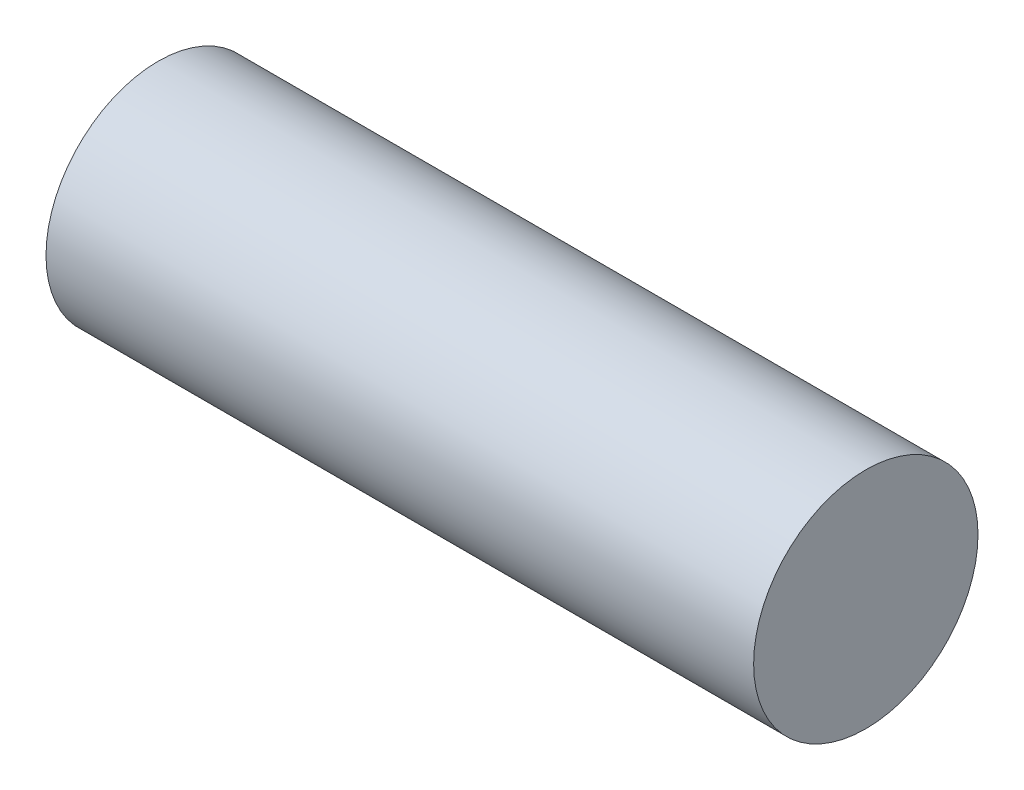
ISO-10303-21;
HEADER;
FILE_DESCRIPTION(('STEP AP214'),'2;1');
FILE_NAME('part.step','',(''),(''),'','','');
FILE_SCHEMA(('AUTOMOTIVE_DESIGN { 1 0 10303 214 1 1 1 1 }'));
ENDSEC;
DATA;
#1=APPLICATION_CONTEXT('core data for automotive mechanical design processes');
#2=APPLICATION_PROTOCOL_DEFINITION('international standard','automotive_design',2000,#1);
#3=PRODUCT_CONTEXT('',#1,'mechanical');
#4=PRODUCT('Part','Part','',(#3));
#5=PRODUCT_RELATED_PRODUCT_CATEGORY('part','',(#4));
#6=PRODUCT_DEFINITION_FORMATION('','',#4);
#7=PRODUCT_DEFINITION_CONTEXT('part definition',#1,'design');
#8=PRODUCT_DEFINITION('design','',#6,#7);
#9=PRODUCT_DEFINITION_SHAPE('','',#8);
#10=(LENGTH_UNIT() NAMED_UNIT(*) SI_UNIT(.MILLI.,.METRE.));
#11=(NAMED_UNIT(*) PLANE_ANGLE_UNIT() SI_UNIT($,.RADIAN.));
#12=(NAMED_UNIT(*) SI_UNIT($,.STERADIAN.) SOLID_ANGLE_UNIT());
#13=UNCERTAINTY_MEASURE_WITH_UNIT(LENGTH_MEASURE(1.E-05),#10,'distance_accuracy_value','');
#14=(GEOMETRIC_REPRESENTATION_CONTEXT(3) GLOBAL_UNCERTAINTY_ASSIGNED_CONTEXT((#13)) GLOBAL_UNIT_ASSIGNED_CONTEXT((#10,
#11,#12)) REPRESENTATION_CONTEXT('',''));
#15=CARTESIAN_POINT('',(0.,0.,0.));
#16=DIRECTION('',(0.,0.,1.));
#17=DIRECTION('',(1.,0.,0.));
#18=AXIS2_PLACEMENT_3D('',#15,#16,#17);
#19=CARTESIAN_POINT('',(20.5,0.,0.));
#20=DIRECTION('',(-1.,0.,0.));
#21=DIRECTION('',(0.,0.,1.));
#22=AXIS2_PLACEMENT_3D('',#19,#20,#21);
#23=CYLINDRICAL_SURFACE('',#22,6.5);
#24=CARTESIAN_POINT('',(20.5,0.,0.));
#25=DIRECTION('',(1.,0.,0.));
#26=DIRECTION('',(0.,0.,-1.));
#27=AXIS2_PLACEMENT_3D('',#24,#25,#26);
#28=CIRCLE('',#27,6.5);
#29=CARTESIAN_POINT('',(20.5,0.,-6.5));
#30=VERTEX_POINT('',#29);
#31=EDGE_CURVE('E10',#30,#30,#28,.T.);
#32=ORIENTED_EDGE('',*,*,#31,.F.);
#33=EDGE_LOOP('',(#32));
#34=FACE_BOUND('',#33,.T.);
#35=CARTESIAN_POINT('',(-20.5,0.,0.));
#36=DIRECTION('',(1.,0.,0.));
#37=DIRECTION('',(0.,0.,-1.));
#38=AXIS2_PLACEMENT_3D('',#35,#36,#37);
#39=CIRCLE('',#38,6.5);
#40=CARTESIAN_POINT('',(-20.5,0.,-6.5));
#41=VERTEX_POINT('',#40);
#42=EDGE_CURVE('E34',#41,#41,#39,.T.);
#43=ORIENTED_EDGE('',*,*,#42,.T.);
#44=EDGE_LOOP('',(#43));
#45=FACE_BOUND('',#44,.T.);
#46=ADVANCED_FACE('F31',(#34,#45),#23,.T.);
#47=CARTESIAN_POINT('',(20.5,0.,0.));
#48=DIRECTION('',(1.,0.,0.));
#49=DIRECTION('',(0.,0.,-1.));
#50=AXIS2_PLACEMENT_3D('',#47,#48,#49);
#51=PLANE('',#50);
#52=ORIENTED_EDGE('',*,*,#31,.T.);
#53=EDGE_LOOP('',(#52));
#54=FACE_BOUND('',#53,.T.);
#55=ADVANCED_FACE('F46',(#54),#51,.T.);
#56=CARTESIAN_POINT('',(-20.5,0.,0.));
#57=DIRECTION('',(1.,0.,0.));
#58=DIRECTION('',(0.,0.,-1.));
#59=AXIS2_PLACEMENT_3D('',#56,#57,#58);
#60=PLANE('',#59);
#61=ORIENTED_EDGE('',*,*,#42,.F.);
#62=EDGE_LOOP('',(#61));
#63=FACE_BOUND('',#62,.T.);
#64=ADVANCED_FACE('F44',(#63),#60,.F.);
#65=CLOSED_SHELL('',(#46,#55,#64));
#66=MANIFOLD_SOLID_BREP('B2',#65);
#67=ADVANCED_BREP_SHAPE_REPRESENTATION('',(#18,#66),#14);
#68=SHAPE_DEFINITION_REPRESENTATION(#9,#67);
ENDSEC;
END-ISO-10303-21;
